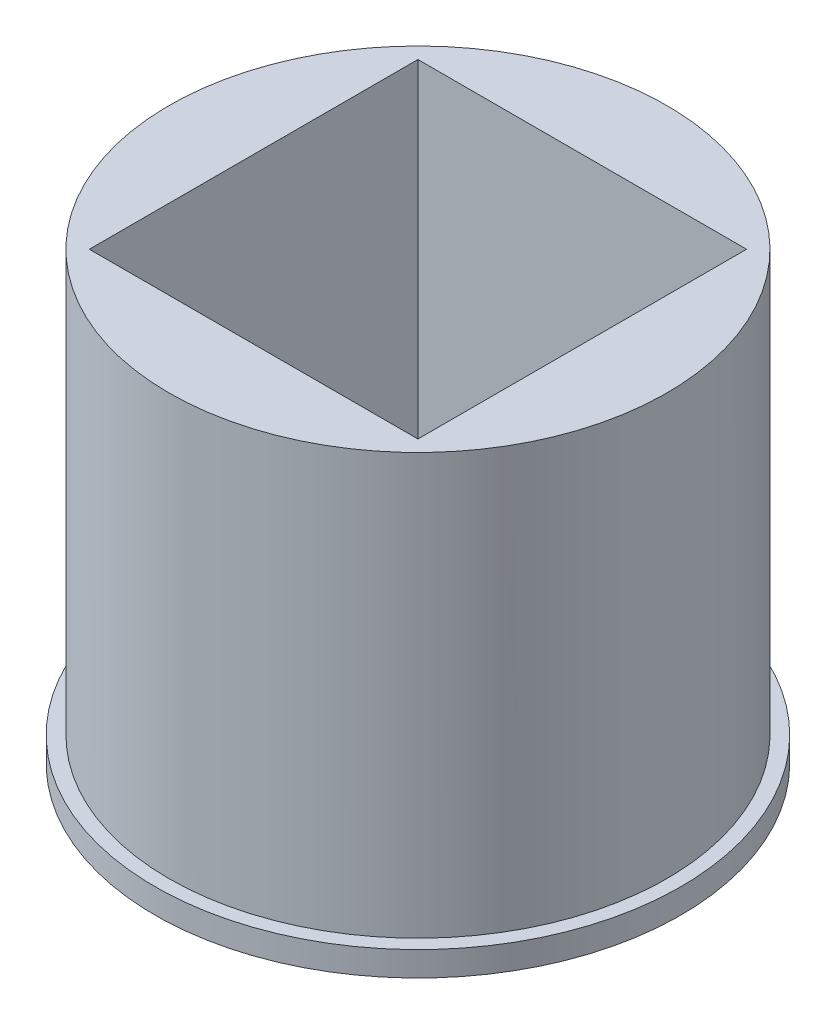
ISO-10303-21;
HEADER;
FILE_DESCRIPTION(('STEP AP214'),'2;1');
FILE_NAME('part.step','',(''),(''),'','','');
FILE_SCHEMA(('AUTOMOTIVE_DESIGN { 1 0 10303 214 1 1 1 1 }'));
ENDSEC;
DATA;
#1=APPLICATION_CONTEXT('core data for automotive mechanical design processes');
#2=APPLICATION_PROTOCOL_DEFINITION('international standard','automotive_design',2000,#1);
#3=PRODUCT_CONTEXT('',#1,'mechanical');
#4=PRODUCT('Part','Part','',(#3));
#5=PRODUCT_RELATED_PRODUCT_CATEGORY('part','',(#4));
#6=PRODUCT_DEFINITION_FORMATION('','',#4);
#7=PRODUCT_DEFINITION_CONTEXT('part definition',#1,'design');
#8=PRODUCT_DEFINITION('design','',#6,#7);
#9=PRODUCT_DEFINITION_SHAPE('','',#8);
#10=(LENGTH_UNIT() NAMED_UNIT(*) SI_UNIT(.MILLI.,.METRE.));
#11=(NAMED_UNIT(*) PLANE_ANGLE_UNIT() SI_UNIT($,.RADIAN.));
#12=(NAMED_UNIT(*) SI_UNIT($,.STERADIAN.) SOLID_ANGLE_UNIT());
#13=UNCERTAINTY_MEASURE_WITH_UNIT(LENGTH_MEASURE(1.E-05),#10,'distance_accuracy_value','');
#14=(GEOMETRIC_REPRESENTATION_CONTEXT(3) GLOBAL_UNCERTAINTY_ASSIGNED_CONTEXT((#13)) GLOBAL_UNIT_ASSIGNED_CONTEXT((#10,
#11,#12)) REPRESENTATION_CONTEXT('',''));
#15=CARTESIAN_POINT('',(0.,0.,0.));
#16=DIRECTION('',(0.,0.,1.));
#17=DIRECTION('',(1.,0.,0.));
#18=AXIS2_PLACEMENT_3D('',#15,#16,#17);
#19=CARTESIAN_POINT('',(0.,-42.8506709399048,0.));
#20=DIRECTION('',(0.,1.,0.));
#21=DIRECTION('',(0.,0.,1.));
#22=AXIS2_PLACEMENT_3D('',#19,#20,#21);
#23=CYLINDRICAL_SURFACE('',#22,15.15);
#24=CARTESIAN_POINT('',(0.,0.,0.));
#25=DIRECTION('',(0.,-1.,0.));
#26=DIRECTION('',(0.,0.,-1.));
#27=AXIS2_PLACEMENT_3D('',#24,#25,#26);
#28=CIRCLE('',#27,15.15);
#29=CARTESIAN_POINT('',(0.,0.,-15.15));
#30=VERTEX_POINT('',#29);
#31=EDGE_CURVE('E116',#30,#30,#28,.F.);
#32=ORIENTED_EDGE('',*,*,#31,.T.);
#33=EDGE_LOOP('',(#32));
#34=FACE_BOUND('',#33,.T.);
#35=CARTESIAN_POINT('',(0.,25.6,0.));
#36=DIRECTION('',(0.,1.,0.));
#37=DIRECTION('',(0.,0.,1.));
#38=AXIS2_PLACEMENT_3D('',#35,#36,#37);
#39=CIRCLE('',#38,15.15);
#40=CARTESIAN_POINT('',(0.,25.6,15.15));
#41=VERTEX_POINT('',#40);
#42=EDGE_CURVE('E89',#41,#41,#39,.T.);
#43=ORIENTED_EDGE('',*,*,#42,.F.);
#44=EDGE_LOOP('',(#43));
#45=FACE_BOUND('',#44,.T.);
#46=ADVANCED_FACE('F43',(#34,#45),#23,.T.);
#47=CARTESIAN_POINT('',(0.,-1.5,0.));
#48=DIRECTION('',(0.,-1.,0.));
#49=DIRECTION('',(0.,0.,-1.));
#50=AXIS2_PLACEMENT_3D('',#47,#48,#49);
#51=PLANE('',#50);
#52=CARTESIAN_POINT('',(0.,-1.5,0.));
#53=DIRECTION('',(0.,-1.,0.));
#54=DIRECTION('',(0.,0.,-1.));
#55=AXIS2_PLACEMENT_3D('',#52,#53,#54);
#56=CIRCLE('',#55,16.);
#57=CARTESIAN_POINT('',(0.,-1.5,-16.));
#58=VERTEX_POINT('',#57);
#59=EDGE_CURVE('E112',#58,#58,#56,.T.);
#60=ORIENTED_EDGE('',*,*,#59,.T.);
#61=EDGE_LOOP('',(#60));
#62=FACE_BOUND('',#61,.T.);
#63=ADVANCED_FACE('F127',(#62),#51,.T.);
#64=CARTESIAN_POINT('',(0.,-1.5,0.));
#65=DIRECTION('',(0.,1.,0.));
#66=DIRECTION('',(0.,0.,1.));
#67=AXIS2_PLACEMENT_3D('',#64,#65,#66);
#68=CYLINDRICAL_SURFACE('',#67,16.);
#69=ORIENTED_EDGE('',*,*,#59,.F.);
#70=EDGE_LOOP('',(#69));
#71=FACE_BOUND('',#70,.T.);
#72=CARTESIAN_POINT('',(0.,0.,0.));
#73=DIRECTION('',(0.,-1.,0.));
#74=DIRECTION('',(0.,0.,-1.));
#75=AXIS2_PLACEMENT_3D('',#72,#73,#74);
#76=CIRCLE('',#75,16.);
#77=CARTESIAN_POINT('',(0.,0.,-16.));
#78=VERTEX_POINT('',#77);
#79=EDGE_CURVE('E113',#78,#78,#76,.T.);
#80=ORIENTED_EDGE('',*,*,#79,.T.);
#81=EDGE_LOOP('',(#80));
#82=FACE_BOUND('',#81,.T.);
#83=ADVANCED_FACE('F133',(#71,#82),#68,.T.);
#84=CARTESIAN_POINT('',(0.,0.,0.));
#85=DIRECTION('',(0.,-1.,0.));
#86=DIRECTION('',(0.,0.,-1.));
#87=AXIS2_PLACEMENT_3D('',#84,#85,#86);
#88=PLANE('',#87);
#89=ORIENTED_EDGE('',*,*,#31,.F.);
#90=EDGE_LOOP('',(#89));
#91=FACE_BOUND('',#90,.T.);
#92=ORIENTED_EDGE('',*,*,#79,.F.);
#93=EDGE_LOOP('',(#92));
#94=FACE_BOUND('',#93,.T.);
#95=ADVANCED_FACE('F138',(#91,#94),#88,.F.);
#96=CARTESIAN_POINT('',(0.,25.6,0.));
#97=DIRECTION('',(0.,1.,0.));
#98=DIRECTION('',(0.,0.,1.));
#99=AXIS2_PLACEMENT_3D('',#96,#97,#98);
#100=PLANE('',#99);
#101=DIRECTION('',(-1.,0.,0.));
#102=VECTOR('',#101,1.);
#103=CARTESIAN_POINT('',(10.,25.6,-10.));
#104=LINE('',#103,#102);
#105=CARTESIAN_POINT('',(10.,25.6,-10.));
#106=VERTEX_POINT('',#105);
#107=CARTESIAN_POINT('',(-10.,25.6,-10.));
#108=VERTEX_POINT('',#107);
#109=EDGE_CURVE('E82',#106,#108,#104,.T.);
#110=ORIENTED_EDGE('',*,*,#109,.F.);
#111=DIRECTION('',(0.,0.,-1.));
#112=VECTOR('',#111,1.);
#113=CARTESIAN_POINT('',(10.,25.6,10.));
#114=LINE('',#113,#112);
#115=CARTESIAN_POINT('',(10.,25.6,10.));
#116=VERTEX_POINT('',#115);
#117=EDGE_CURVE('E85',#116,#106,#114,.T.);
#118=ORIENTED_EDGE('',*,*,#117,.F.);
#119=DIRECTION('',(1.,0.,0.));
#120=VECTOR('',#119,1.);
#121=CARTESIAN_POINT('',(10.,25.6,10.));
#122=LINE('',#121,#120);
#123=CARTESIAN_POINT('',(-10.,25.6,10.));
#124=VERTEX_POINT('',#123);
#125=EDGE_CURVE('E93',#124,#116,#122,.T.);
#126=ORIENTED_EDGE('',*,*,#125,.F.);
#127=DIRECTION('',(0.,0.,1.));
#128=VECTOR('',#127,1.);
#129=CARTESIAN_POINT('',(-10.,25.6,10.));
#130=LINE('',#129,#128);
#131=EDGE_CURVE('E58',#108,#124,#130,.T.);
#132=ORIENTED_EDGE('',*,*,#131,.F.);
#133=EDGE_LOOP('',(#110,#118,#126,#132));
#134=FACE_BOUND('',#133,.T.);
#135=ORIENTED_EDGE('',*,*,#42,.T.);
#136=EDGE_LOOP('',(#135));
#137=FACE_BOUND('',#136,.T.);
#138=ADVANCED_FACE('F83',(#134,#137),#100,.T.);
#139=DIRECTION('',(-1.,0.,0.));
#140=VECTOR('',#139,1.);
#141=CARTESIAN_POINT('',(10.,0.,-10.));
#142=LINE('',#141,#140);
#143=CARTESIAN_POINT('',(10.,0.,-10.));
#144=VERTEX_POINT('',#143);
#145=CARTESIAN_POINT('',(-10.,0.,-10.));
#146=VERTEX_POINT('',#145);
#147=EDGE_CURVE('E97',#144,#146,#142,.T.);
#148=ORIENTED_EDGE('',*,*,#147,.T.);
#149=DIRECTION('',(0.,0.,1.));
#150=VECTOR('',#149,1.);
#151=CARTESIAN_POINT('',(-10.,0.,10.));
#152=LINE('',#151,#150);
#153=CARTESIAN_POINT('',(-10.,0.,10.));
#154=VERTEX_POINT('',#153);
#155=EDGE_CURVE('E109',#146,#154,#152,.T.);
#156=ORIENTED_EDGE('',*,*,#155,.T.);
#157=DIRECTION('',(1.,0.,0.));
#158=VECTOR('',#157,1.);
#159=CARTESIAN_POINT('',(10.,0.,10.));
#160=LINE('',#159,#158);
#161=CARTESIAN_POINT('',(10.,0.,10.));
#162=VERTEX_POINT('',#161);
#163=EDGE_CURVE('E106',#154,#162,#160,.T.);
#164=ORIENTED_EDGE('',*,*,#163,.T.);
#165=DIRECTION('',(0.,0.,-1.));
#166=VECTOR('',#165,1.);
#167=CARTESIAN_POINT('',(10.,0.,10.));
#168=LINE('',#167,#166);
#169=EDGE_CURVE('E104',#162,#144,#168,.T.);
#170=ORIENTED_EDGE('',*,*,#169,.T.);
#171=EDGE_LOOP('',(#148,#156,#164,#170));
#172=FACE_BOUND('',#171,.T.);
#173=ADVANCED_FACE('F142',(#172),#88,.F.);
#174=CARTESIAN_POINT('',(10.,27.1,-10.));
#175=DIRECTION('',(0.,0.,1.));
#176=DIRECTION('',(1.,0.,0.));
#177=AXIS2_PLACEMENT_3D('',#174,#175,#176);
#178=PLANE('',#177);
#179=DIRECTION('',(0.,-1.,0.));
#180=VECTOR('',#179,1.);
#181=CARTESIAN_POINT('',(10.,27.1,-10.));
#182=LINE('',#181,#180);
#183=EDGE_CURVE('E66',#106,#144,#182,.T.);
#184=ORIENTED_EDGE('',*,*,#183,.F.);
#185=ORIENTED_EDGE('',*,*,#109,.T.);
#186=DIRECTION('',(0.,-1.,0.));
#187=VECTOR('',#186,1.);
#188=CARTESIAN_POINT('',(-10.,27.1,-10.));
#189=LINE('',#188,#187);
#190=EDGE_CURVE('E99',#108,#146,#189,.T.);
#191=ORIENTED_EDGE('',*,*,#190,.T.);
#192=ORIENTED_EDGE('',*,*,#147,.F.);
#193=EDGE_LOOP('',(#184,#185,#191,#192));
#194=FACE_BOUND('',#193,.T.);
#195=ADVANCED_FACE('F95',(#194),#178,.T.);
#196=CARTESIAN_POINT('',(10.,27.1,10.));
#197=DIRECTION('',(-1.,0.,0.));
#198=DIRECTION('',(0.,0.,1.));
#199=AXIS2_PLACEMENT_3D('',#196,#197,#198);
#200=PLANE('',#199);
#201=DIRECTION('',(0.,-1.,0.));
#202=VECTOR('',#201,1.);
#203=CARTESIAN_POINT('',(10.,27.1,10.));
#204=LINE('',#203,#202);
#205=EDGE_CURVE('E51',#116,#162,#204,.T.);
#206=ORIENTED_EDGE('',*,*,#205,.F.);
#207=ORIENTED_EDGE('',*,*,#117,.T.);
#208=ORIENTED_EDGE('',*,*,#183,.T.);
#209=ORIENTED_EDGE('',*,*,#169,.F.);
#210=EDGE_LOOP('',(#206,#207,#208,#209));
#211=FACE_BOUND('',#210,.T.);
#212=ADVANCED_FACE('F92',(#211),#200,.T.);
#213=CARTESIAN_POINT('',(10.,27.1,10.));
#214=DIRECTION('',(0.,0.,-1.));
#215=DIRECTION('',(-1.,0.,0.));
#216=AXIS2_PLACEMENT_3D('',#213,#214,#215);
#217=PLANE('',#216);
#218=DIRECTION('',(0.,-1.,0.));
#219=VECTOR('',#218,1.);
#220=CARTESIAN_POINT('',(-10.,27.1,10.));
#221=LINE('',#220,#219);
#222=EDGE_CURVE('E11',#124,#154,#221,.T.);
#223=ORIENTED_EDGE('',*,*,#222,.F.);
#224=ORIENTED_EDGE('',*,*,#125,.T.);
#225=ORIENTED_EDGE('',*,*,#205,.T.);
#226=ORIENTED_EDGE('',*,*,#163,.F.);
#227=EDGE_LOOP('',(#223,#224,#225,#226));
#228=FACE_BOUND('',#227,.T.);
#229=ADVANCED_FACE('F149',(#228),#217,.T.);
#230=CARTESIAN_POINT('',(-10.,27.1,10.));
#231=DIRECTION('',(1.,0.,0.));
#232=DIRECTION('',(0.,0.,-1.));
#233=AXIS2_PLACEMENT_3D('',#230,#231,#232);
#234=PLANE('',#233);
#235=ORIENTED_EDGE('',*,*,#190,.F.);
#236=ORIENTED_EDGE('',*,*,#131,.T.);
#237=ORIENTED_EDGE('',*,*,#222,.T.);
#238=ORIENTED_EDGE('',*,*,#155,.F.);
#239=EDGE_LOOP('',(#235,#236,#237,#238));
#240=FACE_BOUND('',#239,.T.);
#241=ADVANCED_FACE('F45',(#240),#234,.T.);
#242=CLOSED_SHELL('',(#46,#63,#83,#95,#138,#173,#195,#212,#229,#241));
#243=MANIFOLD_SOLID_BREP('B2',#242);
#244=ADVANCED_BREP_SHAPE_REPRESENTATION('',(#18,#243),#14);
#245=SHAPE_DEFINITION_REPRESENTATION(#9,#244);
ENDSEC;
END-ISO-10303-21;
